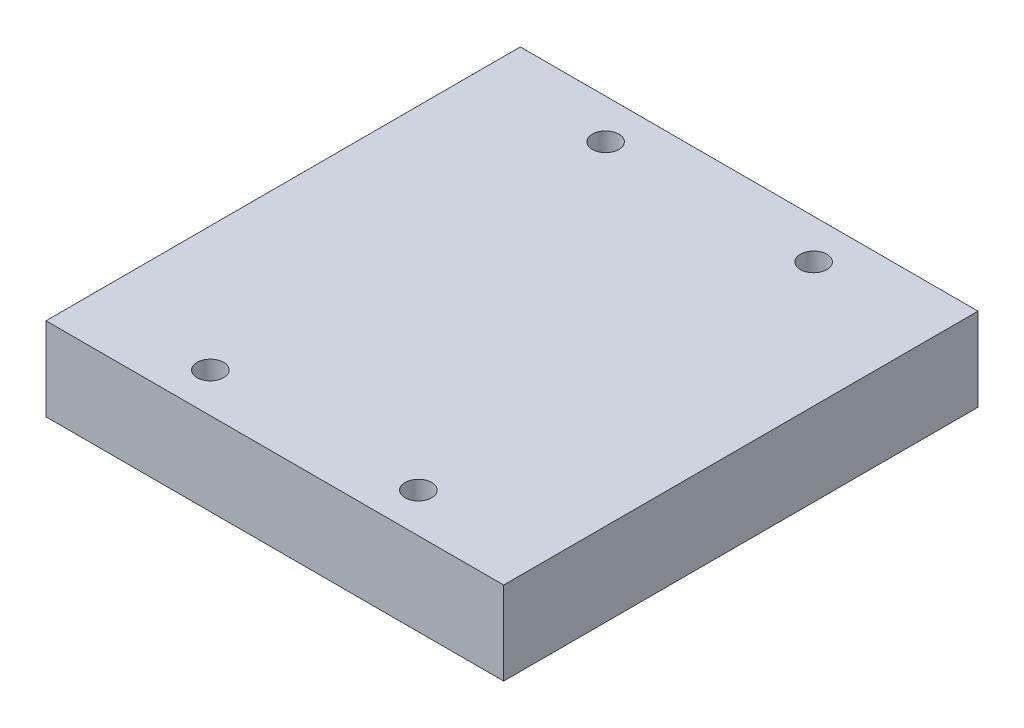
ISO-10303-21;
HEADER;
FILE_DESCRIPTION(('STEP AP214'),'2;1');
FILE_NAME('part.step','',(''),(''),'','','');
FILE_SCHEMA(('AUTOMOTIVE_DESIGN { 1 0 10303 214 1 1 1 1 }'));
ENDSEC;
DATA;
#1=APPLICATION_CONTEXT('core data for automotive mechanical design processes');
#2=APPLICATION_PROTOCOL_DEFINITION('international standard','automotive_design',2000,#1);
#3=PRODUCT_CONTEXT('',#1,'mechanical');
#4=PRODUCT('Part','Part','',(#3));
#5=PRODUCT_RELATED_PRODUCT_CATEGORY('part','',(#4));
#6=PRODUCT_DEFINITION_FORMATION('','',#4);
#7=PRODUCT_DEFINITION_CONTEXT('part definition',#1,'design');
#8=PRODUCT_DEFINITION('design','',#6,#7);
#9=PRODUCT_DEFINITION_SHAPE('','',#8);
#10=(LENGTH_UNIT() NAMED_UNIT(*) SI_UNIT(.MILLI.,.METRE.));
#11=(NAMED_UNIT(*) PLANE_ANGLE_UNIT() SI_UNIT($,.RADIAN.));
#12=(NAMED_UNIT(*) SI_UNIT($,.STERADIAN.) SOLID_ANGLE_UNIT());
#13=UNCERTAINTY_MEASURE_WITH_UNIT(LENGTH_MEASURE(1.E-05),#10,'distance_accuracy_value','');
#14=(GEOMETRIC_REPRESENTATION_CONTEXT(3) GLOBAL_UNCERTAINTY_ASSIGNED_CONTEXT((#13)) GLOBAL_UNIT_ASSIGNED_CONTEXT((#10,
#11,#12)) REPRESENTATION_CONTEXT('',''));
#15=CARTESIAN_POINT('',(0.,0.,0.));
#16=DIRECTION('',(0.,0.,1.));
#17=DIRECTION('',(1.,0.,0.));
#18=AXIS2_PLACEMENT_3D('',#15,#16,#17);
#19=CARTESIAN_POINT('',(-13.1673306772908,10.,33.6932270916335));
#20=DIRECTION('',(1.,0.,0.));
#21=DIRECTION('',(0.,0.,-1.));
#22=AXIS2_PLACEMENT_3D('',#19,#20,#21);
#23=PLANE('',#22);
#24=DIRECTION('',(0.,0.,1.));
#25=VECTOR('',#24,1.);
#26=CARTESIAN_POINT('',(-13.1673306772908,0.,33.6932270916335));
#27=LINE('',#26,#25);
#28=CARTESIAN_POINT('',(-13.1673306772908,0.,-23.3067729083665));
#29=VERTEX_POINT('',#28);
#30=CARTESIAN_POINT('',(-13.1673306772908,0.,33.6932270916335));
#31=VERTEX_POINT('',#30);
#32=EDGE_CURVE('E100',#29,#31,#27,.T.);
#33=ORIENTED_EDGE('',*,*,#32,.T.);
#34=DIRECTION('',(0.,-1.,0.));
#35=VECTOR('',#34,1.);
#36=CARTESIAN_POINT('',(-13.1673306772908,10.,33.6932270916335));
#37=LINE('',#36,#35);
#38=CARTESIAN_POINT('',(-13.1673306772908,10.,33.6932270916335));
#39=VERTEX_POINT('',#38);
#40=EDGE_CURVE('E11',#39,#31,#37,.T.);
#41=ORIENTED_EDGE('',*,*,#40,.F.);
#42=DIRECTION('',(0.,0.,1.));
#43=VECTOR('',#42,1.);
#44=CARTESIAN_POINT('',(-13.1673306772908,10.,33.6932270916335));
#45=LINE('',#44,#43);
#46=CARTESIAN_POINT('',(-13.1673306772908,10.,-23.3067729083665));
#47=VERTEX_POINT('',#46);
#48=EDGE_CURVE('E88',#47,#39,#45,.T.);
#49=ORIENTED_EDGE('',*,*,#48,.F.);
#50=DIRECTION('',(0.,-1.,0.));
#51=VECTOR('',#50,1.);
#52=CARTESIAN_POINT('',(-13.1673306772908,10.,-23.3067729083665));
#53=LINE('',#52,#51);
#54=EDGE_CURVE('E96',#47,#29,#53,.T.);
#55=ORIENTED_EDGE('',*,*,#54,.T.);
#56=EDGE_LOOP('',(#33,#41,#49,#55));
#57=FACE_BOUND('',#56,.T.);
#58=ADVANCED_FACE('F37',(#57),#23,.F.);
#59=CARTESIAN_POINT('',(41.8326693227092,10.,33.6932270916335));
#60=DIRECTION('',(0.,0.,-1.));
#61=DIRECTION('',(-1.,0.,0.));
#62=AXIS2_PLACEMENT_3D('',#59,#60,#61);
#63=PLANE('',#62);
#64=DIRECTION('',(1.,0.,0.));
#65=VECTOR('',#64,1.);
#66=CARTESIAN_POINT('',(41.8326693227092,0.,33.6932270916335));
#67=LINE('',#66,#65);
#68=CARTESIAN_POINT('',(41.8326693227092,0.,33.6932270916335));
#69=VERTEX_POINT('',#68);
#70=EDGE_CURVE('E92',#31,#69,#67,.T.);
#71=ORIENTED_EDGE('',*,*,#70,.T.);
#72=DIRECTION('',(0.,-1.,0.));
#73=VECTOR('',#72,1.);
#74=CARTESIAN_POINT('',(41.8326693227092,10.,33.6932270916335));
#75=LINE('',#74,#73);
#76=CARTESIAN_POINT('',(41.8326693227092,10.,33.6932270916335));
#77=VERTEX_POINT('',#76);
#78=EDGE_CURVE('E45',#77,#69,#75,.T.);
#79=ORIENTED_EDGE('',*,*,#78,.F.);
#80=DIRECTION('',(1.,0.,0.));
#81=VECTOR('',#80,1.);
#82=CARTESIAN_POINT('',(41.8326693227092,10.,33.6932270916335));
#83=LINE('',#82,#81);
#84=EDGE_CURVE('E83',#39,#77,#83,.T.);
#85=ORIENTED_EDGE('',*,*,#84,.F.);
#86=ORIENTED_EDGE('',*,*,#40,.T.);
#87=EDGE_LOOP('',(#71,#79,#85,#86));
#88=FACE_BOUND('',#87,.T.);
#89=ADVANCED_FACE('F91',(#88),#63,.F.);
#90=CARTESIAN_POINT('',(41.8326693227092,10.,-23.3067729083665));
#91=DIRECTION('',(-1.,0.,0.));
#92=DIRECTION('',(0.,0.,1.));
#93=AXIS2_PLACEMENT_3D('',#90,#91,#92);
#94=PLANE('',#93);
#95=DIRECTION('',(0.,0.,-1.));
#96=VECTOR('',#95,1.);
#97=CARTESIAN_POINT('',(41.8326693227092,0.,-23.3067729083665));
#98=LINE('',#97,#96);
#99=CARTESIAN_POINT('',(41.8326693227092,0.,-23.3067729083665));
#100=VERTEX_POINT('',#99);
#101=EDGE_CURVE('E70',#69,#100,#98,.T.);
#102=ORIENTED_EDGE('',*,*,#101,.T.);
#103=DIRECTION('',(0.,-1.,0.));
#104=VECTOR('',#103,1.);
#105=CARTESIAN_POINT('',(41.8326693227092,10.,-23.3067729083665));
#106=LINE('',#105,#104);
#107=CARTESIAN_POINT('',(41.8326693227092,10.,-23.3067729083665));
#108=VERTEX_POINT('',#107);
#109=EDGE_CURVE('E93',#108,#100,#106,.T.);
#110=ORIENTED_EDGE('',*,*,#109,.F.);
#111=DIRECTION('',(0.,0.,-1.));
#112=VECTOR('',#111,1.);
#113=CARTESIAN_POINT('',(41.8326693227092,10.,-23.3067729083665));
#114=LINE('',#113,#112);
#115=EDGE_CURVE('E86',#77,#108,#114,.T.);
#116=ORIENTED_EDGE('',*,*,#115,.F.);
#117=ORIENTED_EDGE('',*,*,#78,.T.);
#118=EDGE_LOOP('',(#102,#110,#116,#117));
#119=FACE_BOUND('',#118,.T.);
#120=ADVANCED_FACE('F94',(#119),#94,.F.);
#121=CARTESIAN_POINT('',(-13.1673306772908,10.,-23.3067729083665));
#122=DIRECTION('',(0.,0.,1.));
#123=DIRECTION('',(1.,0.,0.));
#124=AXIS2_PLACEMENT_3D('',#121,#122,#123);
#125=PLANE('',#124);
#126=DIRECTION('',(-1.,0.,0.));
#127=VECTOR('',#126,1.);
#128=CARTESIAN_POINT('',(-13.1673306772908,0.,-23.3067729083665));
#129=LINE('',#128,#127);
#130=EDGE_CURVE('E76',#100,#29,#129,.T.);
#131=ORIENTED_EDGE('',*,*,#130,.T.);
#132=ORIENTED_EDGE('',*,*,#54,.F.);
#133=DIRECTION('',(-1.,0.,0.));
#134=VECTOR('',#133,1.);
#135=CARTESIAN_POINT('',(-13.1673306772908,10.,-23.3067729083665));
#136=LINE('',#135,#134);
#137=EDGE_CURVE('E53',#108,#47,#136,.T.);
#138=ORIENTED_EDGE('',*,*,#137,.F.);
#139=ORIENTED_EDGE('',*,*,#109,.T.);
#140=EDGE_LOOP('',(#131,#132,#138,#139));
#141=FACE_BOUND('',#140,.T.);
#142=ADVANCED_FACE('F108',(#141),#125,.F.);
#143=CARTESIAN_POINT('',(0.,10.,0.));
#144=DIRECTION('',(0.,-1.,0.));
#145=DIRECTION('',(0.,0.,-1.));
#146=AXIS2_PLACEMENT_3D('',#143,#144,#145);
#147=PLANE('',#146);
#148=CARTESIAN_POINT('',(26.8326693227092,10.,28.9432270916335));
#149=DIRECTION('',(0.,-1.,0.));
#150=DIRECTION('',(0.,0.,-1.));
#151=AXIS2_PLACEMENT_3D('',#148,#149,#150);
#152=CIRCLE('',#151,1.6);
#153=CARTESIAN_POINT('',(26.8326693227092,10.,27.3432270916335));
#154=VERTEX_POINT('',#153);
#155=EDGE_CURVE('E103',#154,#154,#152,.T.);
#156=ORIENTED_EDGE('',*,*,#155,.T.);
#157=EDGE_LOOP('',(#156));
#158=FACE_BOUND('',#157,.T.);
#159=CARTESIAN_POINT('',(1.83266932270916,10.,-18.5567729083665));
#160=DIRECTION('',(0.,-1.,0.));
#161=DIRECTION('',(0.,0.,-1.));
#162=AXIS2_PLACEMENT_3D('',#159,#160,#161);
#163=CIRCLE('',#162,1.6);
#164=CARTESIAN_POINT('',(1.83266932270916,10.,-20.1567729083665));
#165=VERTEX_POINT('',#164);
#166=EDGE_CURVE('E116',#165,#165,#163,.T.);
#167=ORIENTED_EDGE('',*,*,#166,.T.);
#168=EDGE_LOOP('',(#167));
#169=FACE_BOUND('',#168,.T.);
#170=CARTESIAN_POINT('',(26.8326693227092,10.,-18.5567729083665));
#171=DIRECTION('',(0.,-1.,0.));
#172=DIRECTION('',(0.,0.,-1.));
#173=AXIS2_PLACEMENT_3D('',#170,#171,#172);
#174=CIRCLE('',#173,1.6);
#175=CARTESIAN_POINT('',(26.8326693227092,10.,-20.1567729083665));
#176=VERTEX_POINT('',#175);
#177=EDGE_CURVE('E119',#176,#176,#174,.T.);
#178=ORIENTED_EDGE('',*,*,#177,.T.);
#179=EDGE_LOOP('',(#178));
#180=FACE_BOUND('',#179,.T.);
#181=CARTESIAN_POINT('',(1.83266932270916,10.,28.9432270916335));
#182=DIRECTION('',(0.,-1.,0.));
#183=DIRECTION('',(0.,0.,-1.));
#184=AXIS2_PLACEMENT_3D('',#181,#182,#183);
#185=CIRCLE('',#184,1.6);
#186=CARTESIAN_POINT('',(1.83266932270916,10.,27.3432270916335));
#187=VERTEX_POINT('',#186);
#188=EDGE_CURVE('E122',#187,#187,#185,.T.);
#189=ORIENTED_EDGE('',*,*,#188,.T.);
#190=EDGE_LOOP('',(#189));
#191=FACE_BOUND('',#190,.T.);
#192=ORIENTED_EDGE('',*,*,#48,.T.);
#193=ORIENTED_EDGE('',*,*,#84,.T.);
#194=ORIENTED_EDGE('',*,*,#115,.T.);
#195=ORIENTED_EDGE('',*,*,#137,.T.);
#196=EDGE_LOOP('',(#192,#193,#194,#195));
#197=FACE_BOUND('',#196,.T.);
#198=ADVANCED_FACE('F84',(#158,#169,#180,#191,#197),#147,.F.);
#199=CARTESIAN_POINT('',(0.,0.,0.));
#200=DIRECTION('',(0.,-1.,0.));
#201=DIRECTION('',(0.,0.,-1.));
#202=AXIS2_PLACEMENT_3D('',#199,#200,#201);
#203=PLANE('',#202);
#204=CARTESIAN_POINT('',(26.8326693227092,0.,28.9432270916335));
#205=DIRECTION('',(0.,-1.,0.));
#206=DIRECTION('',(0.,0.,-1.));
#207=AXIS2_PLACEMENT_3D('',#204,#205,#206);
#208=CIRCLE('',#207,1.6);
#209=CARTESIAN_POINT('',(26.8326693227092,0.,27.3432270916335));
#210=VERTEX_POINT('',#209);
#211=EDGE_CURVE('E128',#210,#210,#208,.T.);
#212=ORIENTED_EDGE('',*,*,#211,.F.);
#213=EDGE_LOOP('',(#212));
#214=FACE_BOUND('',#213,.T.);
#215=CARTESIAN_POINT('',(1.83266932270916,0.,-18.5567729083665));
#216=DIRECTION('',(0.,-1.,0.));
#217=DIRECTION('',(0.,0.,-1.));
#218=AXIS2_PLACEMENT_3D('',#215,#216,#217);
#219=CIRCLE('',#218,1.6);
#220=CARTESIAN_POINT('',(1.83266932270916,0.,-20.1567729083665));
#221=VERTEX_POINT('',#220);
#222=EDGE_CURVE('E129',#221,#221,#219,.T.);
#223=ORIENTED_EDGE('',*,*,#222,.F.);
#224=EDGE_LOOP('',(#223));
#225=FACE_BOUND('',#224,.T.);
#226=CARTESIAN_POINT('',(26.8326693227092,0.,-18.5567729083665));
#227=DIRECTION('',(0.,-1.,0.));
#228=DIRECTION('',(0.,0.,-1.));
#229=AXIS2_PLACEMENT_3D('',#226,#227,#228);
#230=CIRCLE('',#229,1.6);
#231=CARTESIAN_POINT('',(26.8326693227092,0.,-20.1567729083665));
#232=VERTEX_POINT('',#231);
#233=EDGE_CURVE('E132',#232,#232,#230,.T.);
#234=ORIENTED_EDGE('',*,*,#233,.F.);
#235=EDGE_LOOP('',(#234));
#236=FACE_BOUND('',#235,.T.);
#237=CARTESIAN_POINT('',(1.83266932270916,0.,28.9432270916335));
#238=DIRECTION('',(0.,-1.,0.));
#239=DIRECTION('',(0.,0.,-1.));
#240=AXIS2_PLACEMENT_3D('',#237,#238,#239);
#241=CIRCLE('',#240,1.6);
#242=CARTESIAN_POINT('',(1.83266932270916,0.,27.3432270916335));
#243=VERTEX_POINT('',#242);
#244=EDGE_CURVE('E125',#243,#243,#241,.T.);
#245=ORIENTED_EDGE('',*,*,#244,.F.);
#246=EDGE_LOOP('',(#245));
#247=FACE_BOUND('',#246,.T.);
#248=ORIENTED_EDGE('',*,*,#32,.F.);
#249=ORIENTED_EDGE('',*,*,#130,.F.);
#250=ORIENTED_EDGE('',*,*,#101,.F.);
#251=ORIENTED_EDGE('',*,*,#70,.F.);
#252=EDGE_LOOP('',(#248,#249,#250,#251));
#253=FACE_BOUND('',#252,.T.);
#254=ADVANCED_FACE('F111',(#214,#225,#236,#247,#253),#203,.T.);
#255=CARTESIAN_POINT('',(1.83266932270916,20.,28.9432270916335));
#256=DIRECTION('',(0.,-1.,0.));
#257=DIRECTION('',(0.,0.,-1.));
#258=AXIS2_PLACEMENT_3D('',#255,#256,#257);
#259=CYLINDRICAL_SURFACE('',#258,1.6);
#260=ORIENTED_EDGE('',*,*,#244,.T.);
#261=EDGE_LOOP('',(#260));
#262=FACE_BOUND('',#261,.T.);
#263=ORIENTED_EDGE('',*,*,#188,.F.);
#264=EDGE_LOOP('',(#263));
#265=FACE_BOUND('',#264,.T.);
#266=ADVANCED_FACE('F143',(#262,#265),#259,.F.);
#267=CARTESIAN_POINT('',(26.8326693227092,20.,-18.5567729083665));
#268=DIRECTION('',(0.,-1.,0.));
#269=DIRECTION('',(0.,0.,-1.));
#270=AXIS2_PLACEMENT_3D('',#267,#268,#269);
#271=CYLINDRICAL_SURFACE('',#270,1.6);
#272=ORIENTED_EDGE('',*,*,#233,.T.);
#273=EDGE_LOOP('',(#272));
#274=FACE_BOUND('',#273,.T.);
#275=ORIENTED_EDGE('',*,*,#177,.F.);
#276=EDGE_LOOP('',(#275));
#277=FACE_BOUND('',#276,.T.);
#278=ADVANCED_FACE('F138',(#274,#277),#271,.F.);
#279=CARTESIAN_POINT('',(1.83266932270916,20.,-18.5567729083665));
#280=DIRECTION('',(0.,-1.,0.));
#281=DIRECTION('',(0.,0.,-1.));
#282=AXIS2_PLACEMENT_3D('',#279,#280,#281);
#283=CYLINDRICAL_SURFACE('',#282,1.6);
#284=ORIENTED_EDGE('',*,*,#222,.T.);
#285=EDGE_LOOP('',(#284));
#286=FACE_BOUND('',#285,.T.);
#287=ORIENTED_EDGE('',*,*,#166,.F.);
#288=EDGE_LOOP('',(#287));
#289=FACE_BOUND('',#288,.T.);
#290=ADVANCED_FACE('F204',(#286,#289),#283,.F.);
#291=CARTESIAN_POINT('',(26.8326693227092,20.,28.9432270916335));
#292=DIRECTION('',(0.,-1.,0.));
#293=DIRECTION('',(0.,0.,-1.));
#294=AXIS2_PLACEMENT_3D('',#291,#292,#293);
#295=CYLINDRICAL_SURFACE('',#294,1.6);
#296=ORIENTED_EDGE('',*,*,#211,.T.);
#297=EDGE_LOOP('',(#296));
#298=FACE_BOUND('',#297,.T.);
#299=ORIENTED_EDGE('',*,*,#155,.F.);
#300=EDGE_LOOP('',(#299));
#301=FACE_BOUND('',#300,.T.);
#302=ADVANCED_FACE('F214',(#298,#301),#295,.F.);
#303=CLOSED_SHELL('',(#58,#89,#120,#142,#198,#254,#266,#278,#290,#302));
#304=MANIFOLD_SOLID_BREP('B2',#303);
#305=ADVANCED_BREP_SHAPE_REPRESENTATION('',(#18,#304),#14);
#306=SHAPE_DEFINITION_REPRESENTATION(#9,#305);
ENDSEC;
END-ISO-10303-21;
